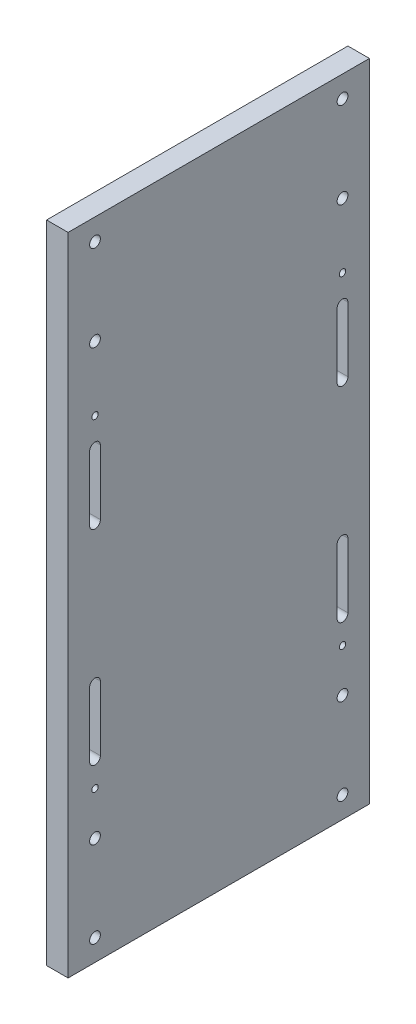
ISO-10303-21;
HEADER;
FILE_DESCRIPTION(('STEP AP214'),'2;1');
FILE_NAME('part.step','',(''),(''),'','','');
FILE_SCHEMA(('AUTOMOTIVE_DESIGN { 1 0 10303 214 1 1 1 1 }'));
ENDSEC;
DATA;
#1=APPLICATION_CONTEXT('core data for automotive mechanical design processes');
#2=APPLICATION_PROTOCOL_DEFINITION('international standard','automotive_design',2000,#1);
#3=PRODUCT_CONTEXT('',#1,'mechanical');
#4=PRODUCT('Part','Part','',(#3));
#5=PRODUCT_RELATED_PRODUCT_CATEGORY('part','',(#4));
#6=PRODUCT_DEFINITION_FORMATION('','',#4);
#7=PRODUCT_DEFINITION_CONTEXT('part definition',#1,'design');
#8=PRODUCT_DEFINITION('design','',#6,#7);
#9=PRODUCT_DEFINITION_SHAPE('','',#8);
#10=(LENGTH_UNIT() NAMED_UNIT(*) SI_UNIT(.MILLI.,.METRE.));
#11=(NAMED_UNIT(*) PLANE_ANGLE_UNIT() SI_UNIT($,.RADIAN.));
#12=(NAMED_UNIT(*) SI_UNIT($,.STERADIAN.) SOLID_ANGLE_UNIT());
#13=UNCERTAINTY_MEASURE_WITH_UNIT(LENGTH_MEASURE(1.E-05),#10,'distance_accuracy_value','');
#14=(GEOMETRIC_REPRESENTATION_CONTEXT(3) GLOBAL_UNCERTAINTY_ASSIGNED_CONTEXT((#13)) GLOBAL_UNIT_ASSIGNED_CONTEXT((#10,
#11,#12)) REPRESENTATION_CONTEXT('',''));
#15=CARTESIAN_POINT('',(0.,0.,0.));
#16=DIRECTION('',(0.,0.,1.));
#17=DIRECTION('',(1.,0.,0.));
#18=AXIS2_PLACEMENT_3D('',#15,#16,#17);
#19=CARTESIAN_POINT('',(-9.99999999999999,300.,-70.));
#20=DIRECTION('',(1.,0.,0.));
#21=DIRECTION('',(0.,0.,-1.));
#22=AXIS2_PLACEMENT_3D('',#19,#20,#21);
#23=PLANE('',#22);
#24=DIRECTION('',(0.,-1.,0.));
#25=VECTOR('',#24,1.);
#26=CARTESIAN_POINT('',(-9.99999999999999,111.940043573294,54.9999999999989));
#27=LINE('',#26,#25);
#28=CARTESIAN_POINT('',(-9.99999999999999,111.940043573294,54.9999999999989));
#29=VERTEX_POINT('',#28);
#30=CARTESIAN_POINT('',(-9.99999999999999,81.9400435732942,54.9999999999999));
#31=VERTEX_POINT('',#30);
#32=EDGE_CURVE('E263',#29,#31,#27,.T.);
#33=ORIENTED_EDGE('',*,*,#32,.F.);
#34=CARTESIAN_POINT('',(-9.99999999999999,111.940043573294,57.5000000000009));
#35=DIRECTION('',(-1.,0.,0.));
#36=DIRECTION('',(0.,0.,1.));
#37=AXIS2_PLACEMENT_3D('',#34,#35,#36);
#38=CIRCLE('',#37,2.50000000000098);
#39=CARTESIAN_POINT('',(-9.99999999999999,111.940043573294,60.0000000000009));
#40=VERTEX_POINT('',#39);
#41=EDGE_CURVE('E52',#40,#29,#38,.T.);
#42=ORIENTED_EDGE('',*,*,#41,.F.);
#43=DIRECTION('',(0.,1.,0.));
#44=VECTOR('',#43,1.);
#45=CARTESIAN_POINT('',(-9.99999999999999,111.940043573294,60.0000000000009));
#46=LINE('',#45,#44);
#47=CARTESIAN_POINT('',(-9.99999999999999,81.9400435732942,60.0000000000009));
#48=VERTEX_POINT('',#47);
#49=EDGE_CURVE('E252',#48,#40,#46,.T.);
#50=ORIENTED_EDGE('',*,*,#49,.F.);
#51=CARTESIAN_POINT('',(-9.99999999999999,81.9400435732942,57.5000000000009));
#52=DIRECTION('',(-1.,0.,0.));
#53=DIRECTION('',(0.,0.,1.));
#54=AXIS2_PLACEMENT_3D('',#51,#52,#53);
#55=CIRCLE('',#54,2.50000000000098);
#56=EDGE_CURVE('E266',#31,#48,#55,.T.);
#57=ORIENTED_EDGE('',*,*,#56,.F.);
#58=EDGE_LOOP('',(#33,#42,#50,#57));
#59=FACE_BOUND('',#58,.T.);
#60=DIRECTION('',(0.,-1.,0.));
#61=VECTOR('',#60,1.);
#62=CARTESIAN_POINT('',(-9.99999999999999,111.940043573293,-60.0000000000011));
#63=LINE('',#62,#61);
#64=CARTESIAN_POINT('',(-9.99999999999999,111.940043573293,-60.0000000000011));
#65=VERTEX_POINT('',#64);
#66=CARTESIAN_POINT('',(-9.99999999999999,81.9400435732934,-60.0000000000001));
#67=VERTEX_POINT('',#66);
#68=EDGE_CURVE('E233',#65,#67,#63,.T.);
#69=ORIENTED_EDGE('',*,*,#68,.F.);
#70=CARTESIAN_POINT('',(-9.99999999999999,111.940043573293,-57.4999999999991));
#71=DIRECTION('',(-1.,0.,0.));
#72=DIRECTION('',(0.,0.,1.));
#73=AXIS2_PLACEMENT_3D('',#70,#71,#72);
#74=CIRCLE('',#73,2.50000000000099);
#75=CARTESIAN_POINT('',(-9.99999999999999,111.940043573293,-54.9999999999991));
#76=VERTEX_POINT('',#75);
#77=EDGE_CURVE('E60',#76,#65,#74,.T.);
#78=ORIENTED_EDGE('',*,*,#77,.F.);
#79=DIRECTION('',(0.,1.,0.));
#80=VECTOR('',#79,1.);
#81=CARTESIAN_POINT('',(-9.99999999999999,111.940043573293,-54.9999999999991));
#82=LINE('',#81,#80);
#83=CARTESIAN_POINT('',(-9.99999999999999,81.9400435732934,-54.9999999999991));
#84=VERTEX_POINT('',#83);
#85=EDGE_CURVE('E222',#84,#76,#82,.T.);
#86=ORIENTED_EDGE('',*,*,#85,.F.);
#87=CARTESIAN_POINT('',(-9.99999999999999,81.9400435732934,-57.4999999999991));
#88=DIRECTION('',(-1.,0.,0.));
#89=DIRECTION('',(0.,0.,1.));
#90=AXIS2_PLACEMENT_3D('',#87,#88,#89);
#91=CIRCLE('',#90,2.50000000000098);
#92=EDGE_CURVE('E237',#67,#84,#91,.T.);
#93=ORIENTED_EDGE('',*,*,#92,.F.);
#94=EDGE_LOOP('',(#69,#78,#86,#93));
#95=FACE_BOUND('',#94,.T.);
#96=DIRECTION('',(0.,-1.,0.));
#97=VECTOR('',#96,1.);
#98=CARTESIAN_POINT('',(-9.99999999999999,206.940043573293,-60.0000000000001));
#99=LINE('',#98,#97);
#100=CARTESIAN_POINT('',(-9.99999999999999,206.940043573293,-60.0000000000001));
#101=VERTEX_POINT('',#100);
#102=CARTESIAN_POINT('',(-9.99999999999999,176.940043573293,-60.0000000000001));
#103=VERTEX_POINT('',#102);
#104=EDGE_CURVE('E207',#101,#103,#99,.T.);
#105=ORIENTED_EDGE('',*,*,#104,.F.);
#106=CARTESIAN_POINT('',(-9.99999999999999,206.940043573293,-57.5000000000001));
#107=DIRECTION('',(-1.,0.,0.));
#108=DIRECTION('',(0.,0.,1.));
#109=AXIS2_PLACEMENT_3D('',#106,#107,#108);
#110=CIRCLE('',#109,2.5);
#111=CARTESIAN_POINT('',(-9.99999999999999,206.940043573293,-55.0000000000001));
#112=VERTEX_POINT('',#111);
#113=EDGE_CURVE('E180',#112,#101,#110,.T.);
#114=ORIENTED_EDGE('',*,*,#113,.F.);
#115=DIRECTION('',(0.,1.,0.));
#116=VECTOR('',#115,1.);
#117=CARTESIAN_POINT('',(-9.99999999999999,206.940043573293,-55.0000000000001));
#118=LINE('',#117,#116);
#119=CARTESIAN_POINT('',(-9.99999999999999,176.940043573293,-55.0000000000001));
#120=VERTEX_POINT('',#119);
#121=EDGE_CURVE('E198',#120,#112,#118,.T.);
#122=ORIENTED_EDGE('',*,*,#121,.F.);
#123=CARTESIAN_POINT('',(-9.99999999999999,176.940043573293,-57.5000000000001));
#124=DIRECTION('',(-1.,0.,0.));
#125=DIRECTION('',(0.,0.,1.));
#126=AXIS2_PLACEMENT_3D('',#123,#124,#125);
#127=CIRCLE('',#126,2.49999999999999);
#128=EDGE_CURVE('E201',#103,#120,#127,.T.);
#129=ORIENTED_EDGE('',*,*,#128,.F.);
#130=EDGE_LOOP('',(#105,#114,#122,#129));
#131=FACE_BOUND('',#130,.T.);
#132=DIRECTION('',(0.,-1.,0.));
#133=VECTOR('',#132,1.);
#134=CARTESIAN_POINT('',(-9.99999999999999,206.940043573294,54.9999999999999));
#135=LINE('',#134,#133);
#136=CARTESIAN_POINT('',(-9.99999999999999,206.940043573294,54.9999999999999));
#137=VERTEX_POINT('',#136);
#138=CARTESIAN_POINT('',(-9.99999999999999,176.940043573294,54.9999999999999));
#139=VERTEX_POINT('',#138);
#140=EDGE_CURVE('E292',#137,#139,#135,.T.);
#141=ORIENTED_EDGE('',*,*,#140,.F.);
#142=CARTESIAN_POINT('',(-9.99999999999999,206.940043573294,57.4999999999999));
#143=DIRECTION('',(-1.,0.,0.));
#144=DIRECTION('',(0.,0.,1.));
#145=AXIS2_PLACEMENT_3D('',#142,#143,#144);
#146=CIRCLE('',#145,2.49999999999999);
#147=CARTESIAN_POINT('',(-9.99999999999999,206.940043573294,59.9999999999999));
#148=VERTEX_POINT('',#147);
#149=EDGE_CURVE('E214',#148,#137,#146,.T.);
#150=ORIENTED_EDGE('',*,*,#149,.F.);
#151=DIRECTION('',(0.,1.,0.));
#152=VECTOR('',#151,1.);
#153=CARTESIAN_POINT('',(-9.99999999999999,206.940043573294,59.9999999999999));
#154=LINE('',#153,#152);
#155=CARTESIAN_POINT('',(-9.99999999999999,176.940043573294,59.9999999999999));
#156=VERTEX_POINT('',#155);
#157=EDGE_CURVE('E281',#156,#148,#154,.T.);
#158=ORIENTED_EDGE('',*,*,#157,.F.);
#159=CARTESIAN_POINT('',(-9.99999999999999,176.940043573294,57.4999999999999));
#160=DIRECTION('',(-1.,0.,0.));
#161=DIRECTION('',(0.,0.,1.));
#162=AXIS2_PLACEMENT_3D('',#159,#160,#161);
#163=CIRCLE('',#162,2.49999999999999);
#164=EDGE_CURVE('E295',#139,#156,#163,.T.);
#165=ORIENTED_EDGE('',*,*,#164,.F.);
#166=EDGE_LOOP('',(#141,#150,#158,#165));
#167=FACE_BOUND('',#166,.T.);
#168=CARTESIAN_POINT('',(-10.,70.,-57.5000000000016));
#169=DIRECTION('',(1.,0.,0.));
#170=DIRECTION('',(0.,0.,-1.));
#171=AXIS2_PLACEMENT_3D('',#168,#169,#170);
#172=CIRCLE('',#171,1.5);
#173=CARTESIAN_POINT('',(-10.,70.,-59.0000000000016));
#174=VERTEX_POINT('',#173);
#175=EDGE_CURVE('E322',#174,#174,#172,.T.);
#176=ORIENTED_EDGE('',*,*,#175,.T.);
#177=EDGE_LOOP('',(#176));
#178=FACE_BOUND('',#177,.T.);
#179=CARTESIAN_POINT('',(-10.,69.9999999999992,57.4999999999984));
#180=DIRECTION('',(1.,0.,0.));
#181=DIRECTION('',(0.,0.,-1.));
#182=AXIS2_PLACEMENT_3D('',#179,#180,#181);
#183=CIRCLE('',#182,1.5);
#184=CARTESIAN_POINT('',(-10.,69.9999999999992,55.9999999999984));
#185=VERTEX_POINT('',#184);
#186=EDGE_CURVE('E316',#185,#185,#183,.T.);
#187=ORIENTED_EDGE('',*,*,#186,.T.);
#188=EDGE_LOOP('',(#187));
#189=FACE_BOUND('',#188,.T.);
#190=CARTESIAN_POINT('',(-10.,219.999999999999,57.5));
#191=DIRECTION('',(1.,0.,0.));
#192=DIRECTION('',(0.,0.,-1.));
#193=AXIS2_PLACEMENT_3D('',#190,#191,#192);
#194=CIRCLE('',#193,1.5);
#195=CARTESIAN_POINT('',(-10.,219.999999999999,56.));
#196=VERTEX_POINT('',#195);
#197=EDGE_CURVE('E309',#196,#196,#194,.T.);
#198=ORIENTED_EDGE('',*,*,#197,.T.);
#199=EDGE_LOOP('',(#198));
#200=FACE_BOUND('',#199,.T.);
#201=CARTESIAN_POINT('',(-10.,220.,-57.5));
#202=DIRECTION('',(1.,0.,0.));
#203=DIRECTION('',(0.,0.,-1.));
#204=AXIS2_PLACEMENT_3D('',#201,#202,#203);
#205=CIRCLE('',#204,1.5);
#206=CARTESIAN_POINT('',(-10.,220.,-59.));
#207=VERTEX_POINT('',#206);
#208=EDGE_CURVE('E327',#207,#207,#205,.T.);
#209=ORIENTED_EDGE('',*,*,#208,.T.);
#210=EDGE_LOOP('',(#209));
#211=FACE_BOUND('',#210,.T.);
#212=CARTESIAN_POINT('',(-9.99999999999998,9.9999999999992,-57.5));
#213=DIRECTION('',(-1.,0.,0.));
#214=DIRECTION('',(0.,0.,1.));
#215=AXIS2_PLACEMENT_3D('',#212,#213,#214);
#216=CIRCLE('',#215,2.49999999999999);
#217=CARTESIAN_POINT('',(-9.99999999999998,9.9999999999992,-55.));
#218=VERTEX_POINT('',#217);
#219=EDGE_CURVE('E355',#218,#218,#216,.T.);
#220=ORIENTED_EDGE('',*,*,#219,.F.);
#221=EDGE_LOOP('',(#220));
#222=FACE_BOUND('',#221,.T.);
#223=CARTESIAN_POINT('',(-9.99999999999998,49.9999999999992,-57.5));
#224=DIRECTION('',(-1.,0.,0.));
#225=DIRECTION('',(0.,0.,1.));
#226=AXIS2_PLACEMENT_3D('',#223,#224,#225);
#227=CIRCLE('',#226,2.50000000000001);
#228=CARTESIAN_POINT('',(-9.99999999999998,49.9999999999992,-55.));
#229=VERTEX_POINT('',#228);
#230=EDGE_CURVE('E361',#229,#229,#227,.T.);
#231=ORIENTED_EDGE('',*,*,#230,.F.);
#232=EDGE_LOOP('',(#231));
#233=FACE_BOUND('',#232,.T.);
#234=CARTESIAN_POINT('',(-9.99999999999999,50.,57.5));
#235=DIRECTION('',(-1.,0.,0.));
#236=DIRECTION('',(0.,0.,1.));
#237=AXIS2_PLACEMENT_3D('',#234,#235,#236);
#238=CIRCLE('',#237,2.5);
#239=CARTESIAN_POINT('',(-9.99999999999999,50.,60.));
#240=VERTEX_POINT('',#239);
#241=EDGE_CURVE('E367',#240,#240,#238,.T.);
#242=ORIENTED_EDGE('',*,*,#241,.F.);
#243=EDGE_LOOP('',(#242));
#244=FACE_BOUND('',#243,.T.);
#245=CARTESIAN_POINT('',(-9.99999999999999,250.,57.5));
#246=DIRECTION('',(-1.,0.,0.));
#247=DIRECTION('',(0.,0.,-1.));
#248=AXIS2_PLACEMENT_3D('',#245,#246,#247);
#249=CIRCLE('',#248,2.5);
#250=CARTESIAN_POINT('',(-9.99999999999999,250.,55.));
#251=VERTEX_POINT('',#250);
#252=EDGE_CURVE('E336',#251,#251,#249,.T.);
#253=ORIENTED_EDGE('',*,*,#252,.F.);
#254=EDGE_LOOP('',(#253));
#255=FACE_BOUND('',#254,.T.);
#256=CARTESIAN_POINT('',(-9.99999999999998,250.000000000001,-57.5));
#257=DIRECTION('',(-1.,0.,0.));
#258=DIRECTION('',(0.,0.,-1.));
#259=AXIS2_PLACEMENT_3D('',#256,#257,#258);
#260=CIRCLE('',#259,2.50000000000001);
#261=CARTESIAN_POINT('',(-9.99999999999998,250.000000000001,-60.));
#262=VERTEX_POINT('',#261);
#263=EDGE_CURVE('E337',#262,#262,#260,.T.);
#264=ORIENTED_EDGE('',*,*,#263,.F.);
#265=EDGE_LOOP('',(#264));
#266=FACE_BOUND('',#265,.T.);
#267=CARTESIAN_POINT('',(-9.99999999999998,290.000000000001,-57.5));
#268=DIRECTION('',(-1.,0.,0.));
#269=DIRECTION('',(0.,0.,-1.));
#270=AXIS2_PLACEMENT_3D('',#267,#268,#269);
#271=CIRCLE('',#270,2.5);
#272=CARTESIAN_POINT('',(-9.99999999999998,290.000000000001,-60.));
#273=VERTEX_POINT('',#272);
#274=EDGE_CURVE('E343',#273,#273,#271,.T.);
#275=ORIENTED_EDGE('',*,*,#274,.F.);
#276=EDGE_LOOP('',(#275));
#277=FACE_BOUND('',#276,.T.);
#278=CARTESIAN_POINT('',(-9.99999999999999,290.,57.5));
#279=DIRECTION('',(-1.,0.,0.));
#280=DIRECTION('',(0.,0.,-1.));
#281=AXIS2_PLACEMENT_3D('',#278,#279,#280);
#282=CIRCLE('',#281,2.5);
#283=CARTESIAN_POINT('',(-9.99999999999999,290.,55.));
#284=VERTEX_POINT('',#283);
#285=EDGE_CURVE('E330',#284,#284,#282,.T.);
#286=ORIENTED_EDGE('',*,*,#285,.F.);
#287=EDGE_LOOP('',(#286));
#288=FACE_BOUND('',#287,.T.);
#289=CARTESIAN_POINT('',(-9.99999999999999,10.,57.5));
#290=DIRECTION('',(-1.,0.,0.));
#291=DIRECTION('',(0.,0.,1.));
#292=AXIS2_PLACEMENT_3D('',#289,#290,#291);
#293=CIRCLE('',#292,2.5);
#294=CARTESIAN_POINT('',(-9.99999999999999,10.,60.));
#295=VERTEX_POINT('',#294);
#296=EDGE_CURVE('E354',#295,#295,#293,.T.);
#297=ORIENTED_EDGE('',*,*,#296,.F.);
#298=EDGE_LOOP('',(#297));
#299=FACE_BOUND('',#298,.T.);
#300=DIRECTION('',(0.,0.,-1.));
#301=VECTOR('',#300,1.);
#302=CARTESIAN_POINT('',(-9.99999999999999,0.,-70.));
#303=LINE('',#302,#301);
#304=CARTESIAN_POINT('',(-9.99999999999999,0.,-70.));
#305=VERTEX_POINT('',#304);
#306=CARTESIAN_POINT('',(-9.99999999999999,0.,70.));
#307=VERTEX_POINT('',#306);
#308=EDGE_CURVE('E378',#305,#307,#303,.F.);
#309=ORIENTED_EDGE('',*,*,#308,.T.);
#310=DIRECTION('',(0.,-1.,0.));
#311=VECTOR('',#310,1.);
#312=CARTESIAN_POINT('',(-9.99999999999999,300.,70.));
#313=LINE('',#312,#311);
#314=CARTESIAN_POINT('',(-9.99999999999999,300.,70.));
#315=VERTEX_POINT('',#314);
#316=EDGE_CURVE('E11',#315,#307,#313,.T.);
#317=ORIENTED_EDGE('',*,*,#316,.F.);
#318=DIRECTION('',(0.,0.,-1.));
#319=VECTOR('',#318,1.);
#320=CARTESIAN_POINT('',(-9.99999999999999,300.,-70.));
#321=LINE('',#320,#319);
#322=CARTESIAN_POINT('',(-9.99999999999999,300.,-70.));
#323=VERTEX_POINT('',#322);
#324=EDGE_CURVE('E381',#323,#315,#321,.F.);
#325=ORIENTED_EDGE('',*,*,#324,.F.);
#326=DIRECTION('',(0.,-1.,0.));
#327=VECTOR('',#326,1.);
#328=CARTESIAN_POINT('',(-9.99999999999999,300.,-70.));
#329=LINE('',#328,#327);
#330=EDGE_CURVE('E393',#323,#305,#329,.T.);
#331=ORIENTED_EDGE('',*,*,#330,.T.);
#332=EDGE_LOOP('',(#309,#317,#325,#331));
#333=FACE_BOUND('',#332,.T.);
#334=ADVANCED_FACE('F38',(#59,#95,#131,#167,#178,#189,#200,#211,#222,#233,#244,#255,#266,#277,
#288,#299,#333),#23,.F.);
#335=CARTESIAN_POINT('',(0.,300.,70.));
#336=DIRECTION('',(0.,0.,1.));
#337=DIRECTION('',(1.,0.,0.));
#338=AXIS2_PLACEMENT_3D('',#335,#336,#337);
#339=PLANE('',#338);
#340=DIRECTION('',(-1.,0.,0.));
#341=VECTOR('',#340,1.);
#342=CARTESIAN_POINT('',(0.,0.,70.));
#343=LINE('',#342,#341);
#344=CARTESIAN_POINT('',(0.,0.,70.));
#345=VERTEX_POINT('',#344);
#346=EDGE_CURVE('E396',#345,#307,#343,.T.);
#347=ORIENTED_EDGE('',*,*,#346,.F.);
#348=DIRECTION('',(0.,-1.,0.));
#349=VECTOR('',#348,1.);
#350=CARTESIAN_POINT('',(0.,300.,70.));
#351=LINE('',#350,#349);
#352=CARTESIAN_POINT('',(0.,300.,70.));
#353=VERTEX_POINT('',#352);
#354=EDGE_CURVE('E45',#353,#345,#351,.T.);
#355=ORIENTED_EDGE('',*,*,#354,.F.);
#356=DIRECTION('',(-1.,0.,0.));
#357=VECTOR('',#356,1.);
#358=CARTESIAN_POINT('',(0.,300.,70.));
#359=LINE('',#358,#357);
#360=EDGE_CURVE('E383',#353,#315,#359,.T.);
#361=ORIENTED_EDGE('',*,*,#360,.T.);
#362=ORIENTED_EDGE('',*,*,#316,.T.);
#363=EDGE_LOOP('',(#347,#355,#361,#362));
#364=FACE_BOUND('',#363,.T.);
#365=ADVANCED_FACE('F412',(#364),#339,.T.);
#366=CARTESIAN_POINT('',(0.,300.,-70.));
#367=DIRECTION('',(1.,0.,0.));
#368=DIRECTION('',(0.,0.,-1.));
#369=AXIS2_PLACEMENT_3D('',#366,#367,#368);
#370=PLANE('',#369);
#371=CARTESIAN_POINT('',(0.,111.940043573294,57.5000000000009));
#372=DIRECTION('',(-1.,0.,0.));
#373=DIRECTION('',(0.,0.,1.));
#374=AXIS2_PLACEMENT_3D('',#371,#372,#373);
#375=CIRCLE('',#374,2.50000000000098);
#376=CARTESIAN_POINT('',(0.,111.940043573294,60.0000000000009));
#377=VERTEX_POINT('',#376);
#378=CARTESIAN_POINT('',(0.,111.940043573294,54.9999999999989));
#379=VERTEX_POINT('',#378);
#380=EDGE_CURVE('E248',#377,#379,#375,.T.);
#381=ORIENTED_EDGE('',*,*,#380,.T.);
#382=DIRECTION('',(0.,-1.,0.));
#383=VECTOR('',#382,1.);
#384=CARTESIAN_POINT('',(0.,111.940043573294,54.9999999999989));
#385=LINE('',#384,#383);
#386=CARTESIAN_POINT('',(0.,81.9400435732942,54.9999999999989));
#387=VERTEX_POINT('',#386);
#388=EDGE_CURVE('E251',#379,#387,#385,.T.);
#389=ORIENTED_EDGE('',*,*,#388,.T.);
#390=CARTESIAN_POINT('',(0.,81.9400435732942,57.5000000000009));
#391=DIRECTION('',(-1.,0.,0.));
#392=DIRECTION('',(0.,0.,1.));
#393=AXIS2_PLACEMENT_3D('',#390,#391,#392);
#394=CIRCLE('',#393,2.50000000000098);
#395=CARTESIAN_POINT('',(0.,81.9400435732942,60.0000000000009));
#396=VERTEX_POINT('',#395);
#397=EDGE_CURVE('E255',#387,#396,#394,.T.);
#398=ORIENTED_EDGE('',*,*,#397,.T.);
#399=DIRECTION('',(0.,1.,0.));
#400=VECTOR('',#399,1.);
#401=CARTESIAN_POINT('',(0.,111.940043573294,60.0000000000009));
#402=LINE('',#401,#400);
#403=EDGE_CURVE('E258',#396,#377,#402,.T.);
#404=ORIENTED_EDGE('',*,*,#403,.T.);
#405=EDGE_LOOP('',(#381,#389,#398,#404));
#406=FACE_BOUND('',#405,.T.);
#407=CARTESIAN_POINT('',(0.,111.940043573293,-57.4999999999991));
#408=DIRECTION('',(-1.,0.,0.));
#409=DIRECTION('',(0.,0.,1.));
#410=AXIS2_PLACEMENT_3D('',#407,#408,#409);
#411=CIRCLE('',#410,2.50000000000099);
#412=CARTESIAN_POINT('',(0.,111.940043573293,-54.9999999999991));
#413=VERTEX_POINT('',#412);
#414=CARTESIAN_POINT('',(0.,111.940043573293,-60.0000000000011));
#415=VERTEX_POINT('',#414);
#416=EDGE_CURVE('E218',#413,#415,#411,.T.);
#417=ORIENTED_EDGE('',*,*,#416,.T.);
#418=DIRECTION('',(0.,-1.,0.));
#419=VECTOR('',#418,1.);
#420=CARTESIAN_POINT('',(0.,111.940043573293,-60.0000000000011));
#421=LINE('',#420,#419);
#422=CARTESIAN_POINT('',(0.,81.9400435732934,-60.0000000000011));
#423=VERTEX_POINT('',#422);
#424=EDGE_CURVE('E221',#415,#423,#421,.T.);
#425=ORIENTED_EDGE('',*,*,#424,.T.);
#426=CARTESIAN_POINT('',(0.,81.9400435732934,-57.4999999999991));
#427=DIRECTION('',(-1.,0.,0.));
#428=DIRECTION('',(0.,0.,1.));
#429=AXIS2_PLACEMENT_3D('',#426,#427,#428);
#430=CIRCLE('',#429,2.50000000000098);
#431=CARTESIAN_POINT('',(0.,81.9400435732934,-54.9999999999991));
#432=VERTEX_POINT('',#431);
#433=EDGE_CURVE('E225',#423,#432,#430,.T.);
#434=ORIENTED_EDGE('',*,*,#433,.T.);
#435=DIRECTION('',(0.,1.,0.));
#436=VECTOR('',#435,1.);
#437=CARTESIAN_POINT('',(0.,111.940043573293,-54.9999999999991));
#438=LINE('',#437,#436);
#439=EDGE_CURVE('E228',#432,#413,#438,.T.);
#440=ORIENTED_EDGE('',*,*,#439,.T.);
#441=EDGE_LOOP('',(#417,#425,#434,#440));
#442=FACE_BOUND('',#441,.T.);
#443=CARTESIAN_POINT('',(0.,206.940043573293,-57.5000000000001));
#444=DIRECTION('',(-1.,0.,0.));
#445=DIRECTION('',(0.,0.,1.));
#446=AXIS2_PLACEMENT_3D('',#443,#444,#445);
#447=CIRCLE('',#446,2.5);
#448=CARTESIAN_POINT('',(0.,206.940043573293,-55.0000000000001));
#449=VERTEX_POINT('',#448);
#450=CARTESIAN_POINT('',(0.,206.940043573293,-60.0000000000001));
#451=VERTEX_POINT('',#450);
#452=EDGE_CURVE('E177',#449,#451,#447,.T.);
#453=ORIENTED_EDGE('',*,*,#452,.T.);
#454=DIRECTION('',(0.,-1.,0.));
#455=VECTOR('',#454,1.);
#456=CARTESIAN_POINT('',(0.,206.940043573293,-60.0000000000001));
#457=LINE('',#456,#455);
#458=CARTESIAN_POINT('',(0.,176.940043573293,-60.0000000000001));
#459=VERTEX_POINT('',#458);
#460=EDGE_CURVE('E189',#451,#459,#457,.T.);
#461=ORIENTED_EDGE('',*,*,#460,.T.);
#462=CARTESIAN_POINT('',(0.,176.940043573293,-57.5000000000001));
#463=DIRECTION('',(-1.,0.,0.));
#464=DIRECTION('',(0.,0.,1.));
#465=AXIS2_PLACEMENT_3D('',#462,#463,#464);
#466=CIRCLE('',#465,2.49999999999999);
#467=CARTESIAN_POINT('',(0.,176.940043573293,-55.0000000000001));
#468=VERTEX_POINT('',#467);
#469=EDGE_CURVE('E193',#459,#468,#466,.T.);
#470=ORIENTED_EDGE('',*,*,#469,.T.);
#471=DIRECTION('',(0.,1.,0.));
#472=VECTOR('',#471,1.);
#473=CARTESIAN_POINT('',(0.,206.940043573293,-55.0000000000001));
#474=LINE('',#473,#472);
#475=EDGE_CURVE('E185',#468,#449,#474,.T.);
#476=ORIENTED_EDGE('',*,*,#475,.T.);
#477=EDGE_LOOP('',(#453,#461,#470,#476));
#478=FACE_BOUND('',#477,.T.);
#479=CARTESIAN_POINT('',(0.,206.940043573294,57.4999999999999));
#480=DIRECTION('',(-1.,0.,0.));
#481=DIRECTION('',(0.,0.,1.));
#482=AXIS2_PLACEMENT_3D('',#479,#480,#481);
#483=CIRCLE('',#482,2.49999999999999);
#484=CARTESIAN_POINT('',(0.,206.940043573294,59.9999999999999));
#485=VERTEX_POINT('',#484);
#486=CARTESIAN_POINT('',(0.,206.940043573294,54.9999999999999));
#487=VERTEX_POINT('',#486);
#488=EDGE_CURVE('E277',#485,#487,#483,.T.);
#489=ORIENTED_EDGE('',*,*,#488,.T.);
#490=DIRECTION('',(0.,-1.,0.));
#491=VECTOR('',#490,1.);
#492=CARTESIAN_POINT('',(0.,206.940043573294,54.9999999999999));
#493=LINE('',#492,#491);
#494=CARTESIAN_POINT('',(0.,176.940043573294,54.9999999999999));
#495=VERTEX_POINT('',#494);
#496=EDGE_CURVE('E280',#487,#495,#493,.T.);
#497=ORIENTED_EDGE('',*,*,#496,.T.);
#498=CARTESIAN_POINT('',(0.,176.940043573294,57.4999999999999));
#499=DIRECTION('',(-1.,0.,0.));
#500=DIRECTION('',(0.,0.,1.));
#501=AXIS2_PLACEMENT_3D('',#498,#499,#500);
#502=CIRCLE('',#501,2.49999999999999);
#503=CARTESIAN_POINT('',(0.,176.940043573294,59.9999999999999));
#504=VERTEX_POINT('',#503);
#505=EDGE_CURVE('E284',#495,#504,#502,.T.);
#506=ORIENTED_EDGE('',*,*,#505,.T.);
#507=DIRECTION('',(0.,1.,0.));
#508=VECTOR('',#507,1.);
#509=CARTESIAN_POINT('',(0.,206.940043573294,59.9999999999999));
#510=LINE('',#509,#508);
#511=EDGE_CURVE('E287',#504,#485,#510,.T.);
#512=ORIENTED_EDGE('',*,*,#511,.T.);
#513=EDGE_LOOP('',(#489,#497,#506,#512));
#514=FACE_BOUND('',#513,.T.);
#515=CARTESIAN_POINT('',(0.,70.,-57.5000000000016));
#516=DIRECTION('',(1.,0.,0.));
#517=DIRECTION('',(0.,0.,-1.));
#518=AXIS2_PLACEMENT_3D('',#515,#516,#517);
#519=CIRCLE('',#518,1.5);
#520=CARTESIAN_POINT('',(0.,70.,-59.0000000000016));
#521=VERTEX_POINT('',#520);
#522=EDGE_CURVE('E302',#521,#521,#519,.T.);
#523=ORIENTED_EDGE('',*,*,#522,.F.);
#524=EDGE_LOOP('',(#523));
#525=FACE_BOUND('',#524,.T.);
#526=CARTESIAN_POINT('',(0.,69.9999999999992,57.4999999999984));
#527=DIRECTION('',(1.,0.,0.));
#528=DIRECTION('',(0.,0.,-1.));
#529=AXIS2_PLACEMENT_3D('',#526,#527,#528);
#530=CIRCLE('',#529,1.5);
#531=CARTESIAN_POINT('',(0.,69.9999999999992,55.9999999999984));
#532=VERTEX_POINT('',#531);
#533=EDGE_CURVE('E319',#532,#532,#530,.T.);
#534=ORIENTED_EDGE('',*,*,#533,.F.);
#535=EDGE_LOOP('',(#534));
#536=FACE_BOUND('',#535,.T.);
#537=CARTESIAN_POINT('',(0.,219.999999999999,57.5));
#538=DIRECTION('',(1.,0.,0.));
#539=DIRECTION('',(0.,0.,-1.));
#540=AXIS2_PLACEMENT_3D('',#537,#538,#539);
#541=CIRCLE('',#540,1.5);
#542=CARTESIAN_POINT('',(0.,219.999999999999,56.));
#543=VERTEX_POINT('',#542);
#544=EDGE_CURVE('E313',#543,#543,#541,.T.);
#545=ORIENTED_EDGE('',*,*,#544,.F.);
#546=EDGE_LOOP('',(#545));
#547=FACE_BOUND('',#546,.T.);
#548=CARTESIAN_POINT('',(0.,220.,-57.5));
#549=DIRECTION('',(1.,0.,0.));
#550=DIRECTION('',(0.,0.,-1.));
#551=AXIS2_PLACEMENT_3D('',#548,#549,#550);
#552=CIRCLE('',#551,1.5);
#553=CARTESIAN_POINT('',(0.,220.,-59.));
#554=VERTEX_POINT('',#553);
#555=EDGE_CURVE('E312',#554,#554,#552,.T.);
#556=ORIENTED_EDGE('',*,*,#555,.F.);
#557=EDGE_LOOP('',(#556));
#558=FACE_BOUND('',#557,.T.);
#559=CARTESIAN_POINT('',(0.,9.9999999999992,-57.5));
#560=DIRECTION('',(-1.,0.,0.));
#561=DIRECTION('',(0.,0.,1.));
#562=AXIS2_PLACEMENT_3D('',#559,#560,#561);
#563=CIRCLE('',#562,2.49999999999999);
#564=CARTESIAN_POINT('',(0.,9.9999999999992,-55.));
#565=VERTEX_POINT('',#564);
#566=EDGE_CURVE('E351',#565,#565,#563,.T.);
#567=ORIENTED_EDGE('',*,*,#566,.T.);
#568=EDGE_LOOP('',(#567));
#569=FACE_BOUND('',#568,.T.);
#570=CARTESIAN_POINT('',(0.,49.9999999999992,-57.5));
#571=DIRECTION('',(-1.,0.,0.));
#572=DIRECTION('',(0.,0.,1.));
#573=AXIS2_PLACEMENT_3D('',#570,#571,#572);
#574=CIRCLE('',#573,2.50000000000001);
#575=CARTESIAN_POINT('',(0.,49.9999999999992,-55.));
#576=VERTEX_POINT('',#575);
#577=EDGE_CURVE('E358',#576,#576,#574,.T.);
#578=ORIENTED_EDGE('',*,*,#577,.T.);
#579=EDGE_LOOP('',(#578));
#580=FACE_BOUND('',#579,.T.);
#581=CARTESIAN_POINT('',(0.,50.,57.5));
#582=DIRECTION('',(-1.,0.,0.));
#583=DIRECTION('',(0.,0.,1.));
#584=AXIS2_PLACEMENT_3D('',#581,#582,#583);
#585=CIRCLE('',#584,2.5);
#586=CARTESIAN_POINT('',(0.,50.,60.));
#587=VERTEX_POINT('',#586);
#588=EDGE_CURVE('E364',#587,#587,#585,.T.);
#589=ORIENTED_EDGE('',*,*,#588,.T.);
#590=EDGE_LOOP('',(#589));
#591=FACE_BOUND('',#590,.T.);
#592=CARTESIAN_POINT('',(0.,250.,57.5));
#593=DIRECTION('',(-1.,0.,0.));
#594=DIRECTION('',(0.,0.,-1.));
#595=AXIS2_PLACEMENT_3D('',#592,#593,#594);
#596=CIRCLE('',#595,2.5);
#597=CARTESIAN_POINT('',(0.,250.,55.));
#598=VERTEX_POINT('',#597);
#599=EDGE_CURVE('E370',#598,#598,#596,.T.);
#600=ORIENTED_EDGE('',*,*,#599,.T.);
#601=EDGE_LOOP('',(#600));
#602=FACE_BOUND('',#601,.T.);
#603=CARTESIAN_POINT('',(0.,250.000000000001,-57.5));
#604=DIRECTION('',(-1.,0.,0.));
#605=DIRECTION('',(0.,0.,-1.));
#606=AXIS2_PLACEMENT_3D('',#603,#604,#605);
#607=CIRCLE('',#606,2.50000000000001);
#608=CARTESIAN_POINT('',(0.,250.000000000001,-60.));
#609=VERTEX_POINT('',#608);
#610=EDGE_CURVE('E333',#609,#609,#607,.T.);
#611=ORIENTED_EDGE('',*,*,#610,.T.);
#612=EDGE_LOOP('',(#611));
#613=FACE_BOUND('',#612,.T.);
#614=CARTESIAN_POINT('',(0.,290.000000000001,-57.5));
#615=DIRECTION('',(-1.,0.,0.));
#616=DIRECTION('',(0.,0.,-1.));
#617=AXIS2_PLACEMENT_3D('',#614,#615,#616);
#618=CIRCLE('',#617,2.5);
#619=CARTESIAN_POINT('',(0.,290.000000000001,-60.));
#620=VERTEX_POINT('',#619);
#621=EDGE_CURVE('E340',#620,#620,#618,.T.);
#622=ORIENTED_EDGE('',*,*,#621,.T.);
#623=EDGE_LOOP('',(#622));
#624=FACE_BOUND('',#623,.T.);
#625=CARTESIAN_POINT('',(0.,290.,57.5));
#626=DIRECTION('',(-1.,0.,0.));
#627=DIRECTION('',(0.,0.,-1.));
#628=AXIS2_PLACEMENT_3D('',#625,#626,#627);
#629=CIRCLE('',#628,2.5);
#630=CARTESIAN_POINT('',(0.,290.,55.));
#631=VERTEX_POINT('',#630);
#632=EDGE_CURVE('E346',#631,#631,#629,.T.);
#633=ORIENTED_EDGE('',*,*,#632,.T.);
#634=EDGE_LOOP('',(#633));
#635=FACE_BOUND('',#634,.T.);
#636=CARTESIAN_POINT('',(0.,10.,57.5));
#637=DIRECTION('',(-1.,0.,0.));
#638=DIRECTION('',(0.,0.,1.));
#639=AXIS2_PLACEMENT_3D('',#636,#637,#638);
#640=CIRCLE('',#639,2.5);
#641=CARTESIAN_POINT('',(0.,10.,60.));
#642=VERTEX_POINT('',#641);
#643=EDGE_CURVE('E375',#642,#642,#640,.T.);
#644=ORIENTED_EDGE('',*,*,#643,.T.);
#645=EDGE_LOOP('',(#644));
#646=FACE_BOUND('',#645,.T.);
#647=DIRECTION('',(0.,0.,1.));
#648=VECTOR('',#647,1.);
#649=CARTESIAN_POINT('',(0.,0.,-70.));
#650=LINE('',#649,#648);
#651=CARTESIAN_POINT('',(0.,0.,-70.));
#652=VERTEX_POINT('',#651);
#653=EDGE_CURVE('E399',#652,#345,#650,.T.);
#654=ORIENTED_EDGE('',*,*,#653,.F.);
#655=DIRECTION('',(0.,-1.,0.));
#656=VECTOR('',#655,1.);
#657=CARTESIAN_POINT('',(0.,300.,-70.));
#658=LINE('',#657,#656);
#659=CARTESIAN_POINT('',(0.,300.,-70.));
#660=VERTEX_POINT('',#659);
#661=EDGE_CURVE('E405',#660,#652,#658,.T.);
#662=ORIENTED_EDGE('',*,*,#661,.F.);
#663=DIRECTION('',(0.,0.,1.));
#664=VECTOR('',#663,1.);
#665=CARTESIAN_POINT('',(0.,300.,-70.));
#666=LINE('',#665,#664);
#667=EDGE_CURVE('E387',#660,#353,#666,.T.);
#668=ORIENTED_EDGE('',*,*,#667,.T.);
#669=ORIENTED_EDGE('',*,*,#354,.T.);
#670=EDGE_LOOP('',(#654,#662,#668,#669));
#671=FACE_BOUND('',#670,.T.);
#672=ADVANCED_FACE('F195',(#406,#442,#478,#514,#525,#536,#547,#558,#569,#580,#591,#602,#613,
#624,#635,#646,#671),#370,.T.);
#673=CARTESIAN_POINT('',(-9.99999999999999,300.,-70.));
#674=DIRECTION('',(0.,0.,-1.));
#675=DIRECTION('',(-1.,0.,0.));
#676=AXIS2_PLACEMENT_3D('',#673,#674,#675);
#677=PLANE('',#676);
#678=DIRECTION('',(1.,0.,0.));
#679=VECTOR('',#678,1.);
#680=CARTESIAN_POINT('',(-9.99999999999999,0.,-70.));
#681=LINE('',#680,#679);
#682=EDGE_CURVE('E384',#305,#652,#681,.T.);
#683=ORIENTED_EDGE('',*,*,#682,.F.);
#684=ORIENTED_EDGE('',*,*,#330,.F.);
#685=DIRECTION('',(1.,0.,0.));
#686=VECTOR('',#685,1.);
#687=CARTESIAN_POINT('',(-9.99999999999999,300.,-70.));
#688=LINE('',#687,#686);
#689=EDGE_CURVE('E390',#323,#660,#688,.T.);
#690=ORIENTED_EDGE('',*,*,#689,.T.);
#691=ORIENTED_EDGE('',*,*,#661,.T.);
#692=EDGE_LOOP('',(#683,#684,#690,#691));
#693=FACE_BOUND('',#692,.T.);
#694=ADVANCED_FACE('F419',(#693),#677,.T.);
#695=CARTESIAN_POINT('',(0.,300.,0.));
#696=DIRECTION('',(0.,1.,0.));
#697=DIRECTION('',(1.,0.,0.));
#698=AXIS2_PLACEMENT_3D('',#695,#696,#697);
#699=PLANE('',#698);
#700=ORIENTED_EDGE('',*,*,#324,.T.);
#701=ORIENTED_EDGE('',*,*,#360,.F.);
#702=ORIENTED_EDGE('',*,*,#667,.F.);
#703=ORIENTED_EDGE('',*,*,#689,.F.);
#704=EDGE_LOOP('',(#700,#701,#702,#703));
#705=FACE_BOUND('',#704,.T.);
#706=ADVANCED_FACE('F423',(#705),#699,.T.);
#707=CARTESIAN_POINT('',(0.,0.,0.));
#708=DIRECTION('',(0.,1.,0.));
#709=DIRECTION('',(1.,0.,0.));
#710=AXIS2_PLACEMENT_3D('',#707,#708,#709);
#711=PLANE('',#710);
#712=ORIENTED_EDGE('',*,*,#308,.F.);
#713=ORIENTED_EDGE('',*,*,#682,.T.);
#714=ORIENTED_EDGE('',*,*,#653,.T.);
#715=ORIENTED_EDGE('',*,*,#346,.T.);
#716=EDGE_LOOP('',(#712,#713,#714,#715));
#717=FACE_BOUND('',#716,.T.);
#718=ADVANCED_FACE('F416',(#717),#711,.F.);
#719=CARTESIAN_POINT('',(0.,10.,57.5));
#720=DIRECTION('',(-1.,0.,0.));
#721=DIRECTION('',(0.,0.,1.));
#722=AXIS2_PLACEMENT_3D('',#719,#720,#721);
#723=CYLINDRICAL_SURFACE('',#722,2.5);
#724=ORIENTED_EDGE('',*,*,#643,.F.);
#725=EDGE_LOOP('',(#724));
#726=FACE_BOUND('',#725,.T.);
#727=ORIENTED_EDGE('',*,*,#296,.T.);
#728=EDGE_LOOP('',(#727));
#729=FACE_BOUND('',#728,.T.);
#730=ADVANCED_FACE('F468',(#726,#729),#723,.F.);
#731=CARTESIAN_POINT('',(0.,290.,57.5));
#732=DIRECTION('',(-1.,0.,0.));
#733=DIRECTION('',(0.,0.,1.));
#734=AXIS2_PLACEMENT_3D('',#731,#732,#733);
#735=CYLINDRICAL_SURFACE('',#734,2.5);
#736=ORIENTED_EDGE('',*,*,#632,.F.);
#737=EDGE_LOOP('',(#736));
#738=FACE_BOUND('',#737,.T.);
#739=ORIENTED_EDGE('',*,*,#285,.T.);
#740=EDGE_LOOP('',(#739));
#741=FACE_BOUND('',#740,.T.);
#742=ADVANCED_FACE('F470',(#738,#741),#735,.F.);
#743=CARTESIAN_POINT('',(0.,290.000000000001,-57.5));
#744=DIRECTION('',(-1.,0.,0.));
#745=DIRECTION('',(0.,0.,1.));
#746=AXIS2_PLACEMENT_3D('',#743,#744,#745);
#747=CYLINDRICAL_SURFACE('',#746,2.5);
#748=ORIENTED_EDGE('',*,*,#621,.F.);
#749=EDGE_LOOP('',(#748));
#750=FACE_BOUND('',#749,.T.);
#751=ORIENTED_EDGE('',*,*,#274,.T.);
#752=EDGE_LOOP('',(#751));
#753=FACE_BOUND('',#752,.T.);
#754=ADVANCED_FACE('F477',(#750,#753),#747,.F.);
#755=CARTESIAN_POINT('',(0.,250.000000000001,-57.5));
#756=DIRECTION('',(-1.,0.,0.));
#757=DIRECTION('',(0.,0.,1.));
#758=AXIS2_PLACEMENT_3D('',#755,#756,#757);
#759=CYLINDRICAL_SURFACE('',#758,2.50000000000001);
#760=ORIENTED_EDGE('',*,*,#610,.F.);
#761=EDGE_LOOP('',(#760));
#762=FACE_BOUND('',#761,.T.);
#763=ORIENTED_EDGE('',*,*,#263,.T.);
#764=EDGE_LOOP('',(#763));
#765=FACE_BOUND('',#764,.T.);
#766=ADVANCED_FACE('F569',(#762,#765),#759,.F.);
#767=CARTESIAN_POINT('',(0.,250.,57.5));
#768=DIRECTION('',(-1.,0.,0.));
#769=DIRECTION('',(0.,0.,1.));
#770=AXIS2_PLACEMENT_3D('',#767,#768,#769);
#771=CYLINDRICAL_SURFACE('',#770,2.5);
#772=ORIENTED_EDGE('',*,*,#599,.F.);
#773=EDGE_LOOP('',(#772));
#774=FACE_BOUND('',#773,.T.);
#775=ORIENTED_EDGE('',*,*,#252,.T.);
#776=EDGE_LOOP('',(#775));
#777=FACE_BOUND('',#776,.T.);
#778=ADVANCED_FACE('F484',(#774,#777),#771,.F.);
#779=CARTESIAN_POINT('',(0.,50.,57.5));
#780=DIRECTION('',(-1.,0.,0.));
#781=DIRECTION('',(0.,0.,1.));
#782=AXIS2_PLACEMENT_3D('',#779,#780,#781);
#783=CYLINDRICAL_SURFACE('',#782,2.5);
#784=ORIENTED_EDGE('',*,*,#588,.F.);
#785=EDGE_LOOP('',(#784));
#786=FACE_BOUND('',#785,.T.);
#787=ORIENTED_EDGE('',*,*,#241,.T.);
#788=EDGE_LOOP('',(#787));
#789=FACE_BOUND('',#788,.T.);
#790=ADVANCED_FACE('F581',(#786,#789),#783,.F.);
#791=CARTESIAN_POINT('',(0.,49.9999999999992,-57.5));
#792=DIRECTION('',(-1.,0.,0.));
#793=DIRECTION('',(0.,0.,1.));
#794=AXIS2_PLACEMENT_3D('',#791,#792,#793);
#795=CYLINDRICAL_SURFACE('',#794,2.50000000000001);
#796=ORIENTED_EDGE('',*,*,#577,.F.);
#797=EDGE_LOOP('',(#796));
#798=FACE_BOUND('',#797,.T.);
#799=ORIENTED_EDGE('',*,*,#230,.T.);
#800=EDGE_LOOP('',(#799));
#801=FACE_BOUND('',#800,.T.);
#802=ADVANCED_FACE('F578',(#798,#801),#795,.F.);
#803=CARTESIAN_POINT('',(0.,9.9999999999992,-57.5));
#804=DIRECTION('',(-1.,0.,0.));
#805=DIRECTION('',(0.,0.,1.));
#806=AXIS2_PLACEMENT_3D('',#803,#804,#805);
#807=CYLINDRICAL_SURFACE('',#806,2.49999999999999);
#808=ORIENTED_EDGE('',*,*,#566,.F.);
#809=EDGE_LOOP('',(#808));
#810=FACE_BOUND('',#809,.T.);
#811=ORIENTED_EDGE('',*,*,#219,.T.);
#812=EDGE_LOOP('',(#811));
#813=FACE_BOUND('',#812,.T.);
#814=ADVANCED_FACE('F567',(#810,#813),#807,.F.);
#815=CARTESIAN_POINT('',(-10.,220.,-57.5));
#816=DIRECTION('',(1.,0.,0.));
#817=DIRECTION('',(0.,0.,-1.));
#818=AXIS2_PLACEMENT_3D('',#815,#816,#817);
#819=CYLINDRICAL_SURFACE('',#818,1.5);
#820=ORIENTED_EDGE('',*,*,#208,.F.);
#821=EDGE_LOOP('',(#820));
#822=FACE_BOUND('',#821,.T.);
#823=ORIENTED_EDGE('',*,*,#555,.T.);
#824=EDGE_LOOP('',(#823));
#825=FACE_BOUND('',#824,.T.);
#826=ADVANCED_FACE('F557',(#822,#825),#819,.F.);
#827=CARTESIAN_POINT('',(-10.,219.999999999999,57.5));
#828=DIRECTION('',(1.,0.,0.));
#829=DIRECTION('',(0.,0.,-1.));
#830=AXIS2_PLACEMENT_3D('',#827,#828,#829);
#831=CYLINDRICAL_SURFACE('',#830,1.5);
#832=ORIENTED_EDGE('',*,*,#197,.F.);
#833=EDGE_LOOP('',(#832));
#834=FACE_BOUND('',#833,.T.);
#835=ORIENTED_EDGE('',*,*,#544,.T.);
#836=EDGE_LOOP('',(#835));
#837=FACE_BOUND('',#836,.T.);
#838=ADVANCED_FACE('F553',(#834,#837),#831,.F.);
#839=CARTESIAN_POINT('',(-10.,69.9999999999992,57.4999999999984));
#840=DIRECTION('',(1.,0.,0.));
#841=DIRECTION('',(0.,0.,-1.));
#842=AXIS2_PLACEMENT_3D('',#839,#840,#841);
#843=CYLINDRICAL_SURFACE('',#842,1.5);
#844=ORIENTED_EDGE('',*,*,#186,.F.);
#845=EDGE_LOOP('',(#844));
#846=FACE_BOUND('',#845,.T.);
#847=ORIENTED_EDGE('',*,*,#533,.T.);
#848=EDGE_LOOP('',(#847));
#849=FACE_BOUND('',#848,.T.);
#850=ADVANCED_FACE('F556',(#846,#849),#843,.F.);
#851=CARTESIAN_POINT('',(-10.,70.,-57.5000000000016));
#852=DIRECTION('',(1.,0.,0.));
#853=DIRECTION('',(0.,0.,-1.));
#854=AXIS2_PLACEMENT_3D('',#851,#852,#853);
#855=CYLINDRICAL_SURFACE('',#854,1.5);
#856=ORIENTED_EDGE('',*,*,#175,.F.);
#857=EDGE_LOOP('',(#856));
#858=FACE_BOUND('',#857,.T.);
#859=ORIENTED_EDGE('',*,*,#522,.T.);
#860=EDGE_LOOP('',(#859));
#861=FACE_BOUND('',#860,.T.);
#862=ADVANCED_FACE('F551',(#858,#861),#855,.F.);
#863=CARTESIAN_POINT('',(0.,206.940043573294,57.4999999999999));
#864=DIRECTION('',(-1.,0.,0.));
#865=DIRECTION('',(0.,0.,1.));
#866=AXIS2_PLACEMENT_3D('',#863,#864,#865);
#867=CYLINDRICAL_SURFACE('',#866,2.49999999999999);
#868=ORIENTED_EDGE('',*,*,#149,.T.);
#869=DIRECTION('',(-1.,0.,0.));
#870=VECTOR('',#869,1.);
#871=CARTESIAN_POINT('',(0.,206.940043573294,54.9999999999999));
#872=LINE('',#871,#870);
#873=EDGE_CURVE('E290',#487,#137,#872,.T.);
#874=ORIENTED_EDGE('',*,*,#873,.F.);
#875=ORIENTED_EDGE('',*,*,#488,.F.);
#876=DIRECTION('',(-1.,0.,0.));
#877=VECTOR('',#876,1.);
#878=CARTESIAN_POINT('',(0.,206.940043573294,59.9999999999999));
#879=LINE('',#878,#877);
#880=EDGE_CURVE('E300',#485,#148,#879,.T.);
#881=ORIENTED_EDGE('',*,*,#880,.T.);
#882=EDGE_LOOP('',(#868,#874,#875,#881));
#883=FACE_BOUND('',#882,.T.);
#884=ADVANCED_FACE('F540',(#883),#867,.F.);
#885=CARTESIAN_POINT('',(0.,206.940043573294,59.9999999999999));
#886=DIRECTION('',(0.,0.,1.));
#887=DIRECTION('',(0.,-1.,0.));
#888=AXIS2_PLACEMENT_3D('',#885,#886,#887);
#889=PLANE('',#888);
#890=ORIENTED_EDGE('',*,*,#157,.T.);
#891=ORIENTED_EDGE('',*,*,#880,.F.);
#892=ORIENTED_EDGE('',*,*,#511,.F.);
#893=DIRECTION('',(-1.,0.,0.));
#894=VECTOR('',#893,1.);
#895=CARTESIAN_POINT('',(0.,176.940043573294,59.9999999999999));
#896=LINE('',#895,#894);
#897=EDGE_CURVE('E303',#504,#156,#896,.T.);
#898=ORIENTED_EDGE('',*,*,#897,.T.);
#899=EDGE_LOOP('',(#890,#891,#892,#898));
#900=FACE_BOUND('',#899,.T.);
#901=ADVANCED_FACE('F536',(#900),#889,.F.);
#902=CARTESIAN_POINT('',(0.,176.940043573294,57.4999999999999));
#903=DIRECTION('',(-1.,0.,0.));
#904=DIRECTION('',(0.,0.,1.));
#905=AXIS2_PLACEMENT_3D('',#902,#903,#904);
#906=CYLINDRICAL_SURFACE('',#905,2.49999999999999);
#907=ORIENTED_EDGE('',*,*,#164,.T.);
#908=ORIENTED_EDGE('',*,*,#897,.F.);
#909=ORIENTED_EDGE('',*,*,#505,.F.);
#910=DIRECTION('',(-1.,0.,0.));
#911=VECTOR('',#910,1.);
#912=CARTESIAN_POINT('',(0.,176.940043573294,54.9999999999999));
#913=LINE('',#912,#911);
#914=EDGE_CURVE('E305',#495,#139,#913,.T.);
#915=ORIENTED_EDGE('',*,*,#914,.T.);
#916=EDGE_LOOP('',(#907,#908,#909,#915));
#917=FACE_BOUND('',#916,.T.);
#918=ADVANCED_FACE('F539',(#917),#906,.F.);
#919=CARTESIAN_POINT('',(0.,206.940043573294,54.9999999999999));
#920=DIRECTION('',(0.,0.,-1.));
#921=DIRECTION('',(0.,1.,0.));
#922=AXIS2_PLACEMENT_3D('',#919,#920,#921);
#923=PLANE('',#922);
#924=ORIENTED_EDGE('',*,*,#140,.T.);
#925=ORIENTED_EDGE('',*,*,#914,.F.);
#926=ORIENTED_EDGE('',*,*,#496,.F.);
#927=ORIENTED_EDGE('',*,*,#873,.T.);
#928=EDGE_LOOP('',(#924,#925,#926,#927));
#929=FACE_BOUND('',#928,.T.);
#930=ADVANCED_FACE('F544',(#929),#923,.F.);
#931=CARTESIAN_POINT('',(0.,206.940043573293,-57.5000000000001));
#932=DIRECTION('',(-1.,0.,0.));
#933=DIRECTION('',(0.,0.,1.));
#934=AXIS2_PLACEMENT_3D('',#931,#932,#933);
#935=CYLINDRICAL_SURFACE('',#934,2.5);
#936=ORIENTED_EDGE('',*,*,#113,.T.);
#937=DIRECTION('',(-1.,0.,0.));
#938=VECTOR('',#937,1.);
#939=CARTESIAN_POINT('',(0.,206.940043573293,-60.0000000000001));
#940=LINE('',#939,#938);
#941=EDGE_CURVE('E173',#451,#101,#940,.T.);
#942=ORIENTED_EDGE('',*,*,#941,.F.);
#943=ORIENTED_EDGE('',*,*,#452,.F.);
#944=DIRECTION('',(-1.,0.,0.));
#945=VECTOR('',#944,1.);
#946=CARTESIAN_POINT('',(0.,206.940043573293,-55.0000000000001));
#947=LINE('',#946,#945);
#948=EDGE_CURVE('E212',#449,#112,#947,.T.);
#949=ORIENTED_EDGE('',*,*,#948,.T.);
#950=EDGE_LOOP('',(#936,#942,#943,#949));
#951=FACE_BOUND('',#950,.T.);
#952=ADVANCED_FACE('F175',(#951),#935,.F.);
#953=CARTESIAN_POINT('',(0.,206.940043573293,-55.0000000000001));
#954=DIRECTION('',(0.,0.,1.));
#955=DIRECTION('',(0.,-1.,0.));
#956=AXIS2_PLACEMENT_3D('',#953,#954,#955);
#957=PLANE('',#956);
#958=ORIENTED_EDGE('',*,*,#121,.T.);
#959=ORIENTED_EDGE('',*,*,#948,.F.);
#960=ORIENTED_EDGE('',*,*,#475,.F.);
#961=DIRECTION('',(-1.,0.,0.));
#962=VECTOR('',#961,1.);
#963=CARTESIAN_POINT('',(0.,176.940043573293,-55.0000000000001));
#964=LINE('',#963,#962);
#965=EDGE_CURVE('E215',#468,#120,#964,.T.);
#966=ORIENTED_EDGE('',*,*,#965,.T.);
#967=EDGE_LOOP('',(#958,#959,#960,#966));
#968=FACE_BOUND('',#967,.T.);
#969=ADVANCED_FACE('F752',(#968),#957,.F.);
#970=CARTESIAN_POINT('',(0.,176.940043573293,-57.5000000000001));
#971=DIRECTION('',(-1.,0.,0.));
#972=DIRECTION('',(0.,0.,1.));
#973=AXIS2_PLACEMENT_3D('',#970,#971,#972);
#974=CYLINDRICAL_SURFACE('',#973,2.49999999999999);
#975=ORIENTED_EDGE('',*,*,#128,.T.);
#976=ORIENTED_EDGE('',*,*,#965,.F.);
#977=ORIENTED_EDGE('',*,*,#469,.F.);
#978=DIRECTION('',(-1.,0.,0.));
#979=VECTOR('',#978,1.);
#980=CARTESIAN_POINT('',(0.,176.940043573293,-60.0000000000001));
#981=LINE('',#980,#979);
#982=EDGE_CURVE('E184',#459,#103,#981,.T.);
#983=ORIENTED_EDGE('',*,*,#982,.T.);
#984=EDGE_LOOP('',(#975,#976,#977,#983));
#985=FACE_BOUND('',#984,.T.);
#986=ADVANCED_FACE('F760',(#985),#974,.F.);
#987=CARTESIAN_POINT('',(0.,206.940043573293,-60.0000000000001));
#988=DIRECTION('',(0.,0.,-1.));
#989=DIRECTION('',(0.,1.,0.));
#990=AXIS2_PLACEMENT_3D('',#987,#988,#989);
#991=PLANE('',#990);
#992=ORIENTED_EDGE('',*,*,#104,.T.);
#993=ORIENTED_EDGE('',*,*,#982,.F.);
#994=ORIENTED_EDGE('',*,*,#460,.F.);
#995=ORIENTED_EDGE('',*,*,#941,.T.);
#996=EDGE_LOOP('',(#992,#993,#994,#995));
#997=FACE_BOUND('',#996,.T.);
#998=ADVANCED_FACE('F190',(#997),#991,.F.);
#999=CARTESIAN_POINT('',(0.,111.940043573293,-57.4999999999991));
#1000=DIRECTION('',(-1.,0.,0.));
#1001=DIRECTION('',(0.,0.,1.));
#1002=AXIS2_PLACEMENT_3D('',#999,#1000,#1001);
#1003=CYLINDRICAL_SURFACE('',#1002,2.50000000000099);
#1004=ORIENTED_EDGE('',*,*,#77,.T.);
#1005=DIRECTION('',(-1.,0.,0.));
#1006=VECTOR('',#1005,1.);
#1007=CARTESIAN_POINT('',(0.,111.940043573293,-60.0000000000011));
#1008=LINE('',#1007,#1006);
#1009=EDGE_CURVE('E231',#415,#65,#1008,.T.);
#1010=ORIENTED_EDGE('',*,*,#1009,.F.);
#1011=ORIENTED_EDGE('',*,*,#416,.F.);
#1012=DIRECTION('',(-1.,0.,0.));
#1013=VECTOR('',#1012,1.);
#1014=CARTESIAN_POINT('',(0.,111.940043573293,-54.9999999999991));
#1015=LINE('',#1014,#1013);
#1016=EDGE_CURVE('E208',#413,#76,#1015,.T.);
#1017=ORIENTED_EDGE('',*,*,#1016,.T.);
#1018=EDGE_LOOP('',(#1004,#1010,#1011,#1017));
#1019=FACE_BOUND('',#1018,.T.);
#1020=ADVANCED_FACE('F499',(#1019),#1003,.F.);
#1021=CARTESIAN_POINT('',(0.,111.940043573293,-54.9999999999991));
#1022=DIRECTION('',(0.,0.,1.));
#1023=DIRECTION('',(0.,-1.,0.));
#1024=AXIS2_PLACEMENT_3D('',#1021,#1022,#1023);
#1025=PLANE('',#1024);
#1026=ORIENTED_EDGE('',*,*,#85,.T.);
#1027=ORIENTED_EDGE('',*,*,#1016,.F.);
#1028=ORIENTED_EDGE('',*,*,#439,.F.);
#1029=DIRECTION('',(-1.,0.,0.));
#1030=VECTOR('',#1029,1.);
#1031=CARTESIAN_POINT('',(0.,81.9400435732934,-54.9999999999991));
#1032=LINE('',#1031,#1030);
#1033=EDGE_CURVE('E243',#432,#84,#1032,.T.);
#1034=ORIENTED_EDGE('',*,*,#1033,.T.);
#1035=EDGE_LOOP('',(#1026,#1027,#1028,#1034));
#1036=FACE_BOUND('',#1035,.T.);
#1037=ADVANCED_FACE('F507',(#1036),#1025,.F.);
#1038=CARTESIAN_POINT('',(0.,81.9400435732934,-57.4999999999991));
#1039=DIRECTION('',(-1.,0.,0.));
#1040=DIRECTION('',(0.,0.,1.));
#1041=AXIS2_PLACEMENT_3D('',#1038,#1039,#1040);
#1042=CYLINDRICAL_SURFACE('',#1041,2.50000000000098);
#1043=ORIENTED_EDGE('',*,*,#92,.T.);
#1044=ORIENTED_EDGE('',*,*,#1033,.F.);
#1045=ORIENTED_EDGE('',*,*,#433,.F.);
#1046=DIRECTION('',(-1.,0.,0.));
#1047=VECTOR('',#1046,1.);
#1048=CARTESIAN_POINT('',(0.,81.9400435732934,-60.0000000000001));
#1049=LINE('',#1048,#1047);
#1050=EDGE_CURVE('E245',#423,#67,#1049,.T.);
#1051=ORIENTED_EDGE('',*,*,#1050,.T.);
#1052=EDGE_LOOP('',(#1043,#1044,#1045,#1051));
#1053=FACE_BOUND('',#1052,.T.);
#1054=ADVANCED_FACE('F504',(#1053),#1042,.F.);
#1055=CARTESIAN_POINT('',(0.,111.940043573293,-60.0000000000011));
#1056=DIRECTION('',(0.,0.,-1.));
#1057=DIRECTION('',(0.,1.,0.));
#1058=AXIS2_PLACEMENT_3D('',#1055,#1056,#1057);
#1059=PLANE('',#1058);
#1060=ORIENTED_EDGE('',*,*,#68,.T.);
#1061=ORIENTED_EDGE('',*,*,#1050,.F.);
#1062=ORIENTED_EDGE('',*,*,#424,.F.);
#1063=ORIENTED_EDGE('',*,*,#1009,.T.);
#1064=EDGE_LOOP('',(#1060,#1061,#1062,#1063));
#1065=FACE_BOUND('',#1064,.T.);
#1066=ADVANCED_FACE('F502',(#1065),#1059,.F.);
#1067=CARTESIAN_POINT('',(0.,111.940043573294,57.5000000000009));
#1068=DIRECTION('',(-1.,0.,0.));
#1069=DIRECTION('',(0.,0.,1.));
#1070=AXIS2_PLACEMENT_3D('',#1067,#1068,#1069);
#1071=CYLINDRICAL_SURFACE('',#1070,2.50000000000098);
#1072=ORIENTED_EDGE('',*,*,#41,.T.);
#1073=DIRECTION('',(-1.,0.,0.));
#1074=VECTOR('',#1073,1.);
#1075=CARTESIAN_POINT('',(0.,111.940043573294,54.9999999999989));
#1076=LINE('',#1075,#1074);
#1077=EDGE_CURVE('E261',#379,#29,#1076,.T.);
#1078=ORIENTED_EDGE('',*,*,#1077,.F.);
#1079=ORIENTED_EDGE('',*,*,#380,.F.);
#1080=DIRECTION('',(-1.,0.,0.));
#1081=VECTOR('',#1080,1.);
#1082=CARTESIAN_POINT('',(0.,111.940043573294,60.0000000000009));
#1083=LINE('',#1082,#1081);
#1084=EDGE_CURVE('E234',#377,#40,#1083,.T.);
#1085=ORIENTED_EDGE('',*,*,#1084,.T.);
#1086=EDGE_LOOP('',(#1072,#1078,#1079,#1085));
#1087=FACE_BOUND('',#1086,.T.);
#1088=ADVANCED_FACE('F520',(#1087),#1071,.F.);
#1089=CARTESIAN_POINT('',(0.,111.940043573294,60.0000000000009));
#1090=DIRECTION('',(0.,0.,1.));
#1091=DIRECTION('',(1.,0.,0.));
#1092=AXIS2_PLACEMENT_3D('',#1089,#1090,#1091);
#1093=PLANE('',#1092);
#1094=ORIENTED_EDGE('',*,*,#49,.T.);
#1095=ORIENTED_EDGE('',*,*,#1084,.F.);
#1096=ORIENTED_EDGE('',*,*,#403,.F.);
#1097=DIRECTION('',(-1.,0.,0.));
#1098=VECTOR('',#1097,1.);
#1099=CARTESIAN_POINT('',(0.,81.9400435732942,60.0000000000009));
#1100=LINE('',#1099,#1098);
#1101=EDGE_CURVE('E272',#396,#48,#1100,.T.);
#1102=ORIENTED_EDGE('',*,*,#1101,.T.);
#1103=EDGE_LOOP('',(#1094,#1095,#1096,#1102));
#1104=FACE_BOUND('',#1103,.T.);
#1105=ADVANCED_FACE('F522',(#1104),#1093,.F.);
#1106=CARTESIAN_POINT('',(0.,81.9400435732942,57.5000000000009));
#1107=DIRECTION('',(-1.,0.,0.));
#1108=DIRECTION('',(0.,0.,1.));
#1109=AXIS2_PLACEMENT_3D('',#1106,#1107,#1108);
#1110=CYLINDRICAL_SURFACE('',#1109,2.50000000000098);
#1111=ORIENTED_EDGE('',*,*,#56,.T.);
#1112=ORIENTED_EDGE('',*,*,#1101,.F.);
#1113=ORIENTED_EDGE('',*,*,#397,.F.);
#1114=DIRECTION('',(-1.,0.,0.));
#1115=VECTOR('',#1114,1.);
#1116=CARTESIAN_POINT('',(0.,81.9400435732942,54.9999999999999));
#1117=LINE('',#1116,#1115);
#1118=EDGE_CURVE('E274',#387,#31,#1117,.T.);
#1119=ORIENTED_EDGE('',*,*,#1118,.T.);
#1120=EDGE_LOOP('',(#1111,#1112,#1113,#1119));
#1121=FACE_BOUND('',#1120,.T.);
#1122=ADVANCED_FACE('F525',(#1121),#1110,.F.);
#1123=CARTESIAN_POINT('',(0.,111.940043573294,54.9999999999989));
#1124=DIRECTION('',(0.,0.,-1.));
#1125=DIRECTION('',(0.,1.,0.));
#1126=AXIS2_PLACEMENT_3D('',#1123,#1124,#1125);
#1127=PLANE('',#1126);
#1128=ORIENTED_EDGE('',*,*,#32,.T.);
#1129=ORIENTED_EDGE('',*,*,#1118,.F.);
#1130=ORIENTED_EDGE('',*,*,#388,.F.);
#1131=ORIENTED_EDGE('',*,*,#1077,.T.);
#1132=EDGE_LOOP('',(#1128,#1129,#1130,#1131));
#1133=FACE_BOUND('',#1132,.T.);
#1134=ADVANCED_FACE('F529',(#1133),#1127,.F.);
#1135=CLOSED_SHELL('',(#334,#365,#672,#694,#706,#718,#730,#742,#754,#766,#778,#790,#802,#814,
#826,#838,#850,#862,#884,#901,#918,#930,#952,#969,#986,#998,#1020,#1037,#1054,#1066,#1088,#1105,
#1122,#1134));
#1136=MANIFOLD_SOLID_BREP('B2',#1135);
#1137=ADVANCED_BREP_SHAPE_REPRESENTATION('',(#18,#1136),#14);
#1138=SHAPE_DEFINITION_REPRESENTATION(#9,#1137);
ENDSEC;
END-ISO-10303-21;
